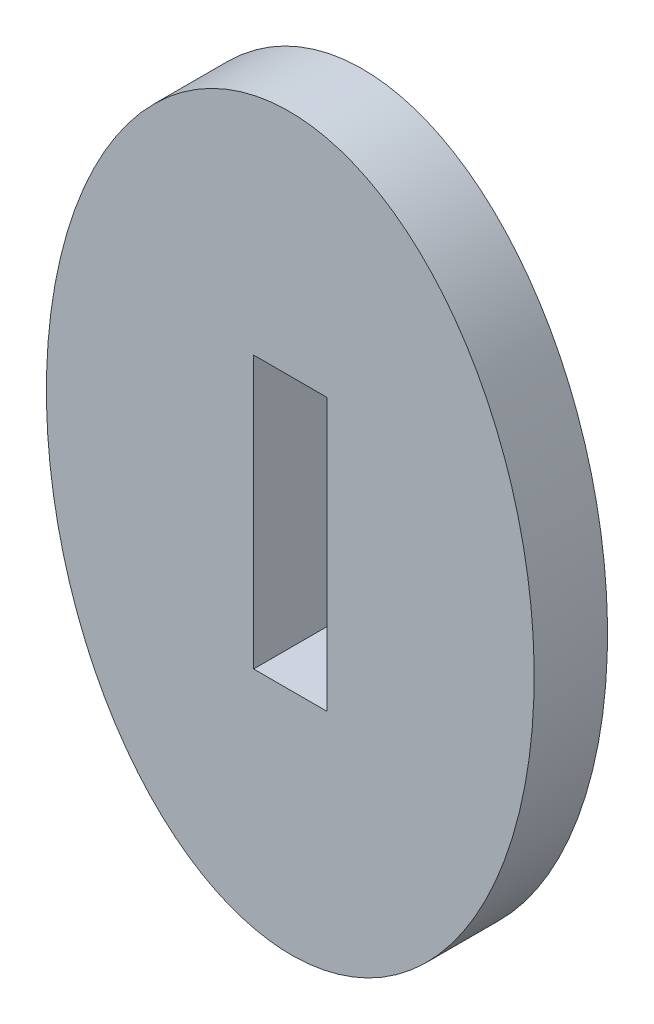
ISO-10303-21;
HEADER;
FILE_DESCRIPTION(('STEP AP214'),'2;1');
FILE_NAME('part.step','',(''),(''),'','','');
FILE_SCHEMA(('AUTOMOTIVE_DESIGN { 1 0 10303 214 1 1 1 1 }'));
ENDSEC;
DATA;
#1=APPLICATION_CONTEXT('core data for automotive mechanical design processes');
#2=APPLICATION_PROTOCOL_DEFINITION('international standard','automotive_design',2000,#1);
#3=PRODUCT_CONTEXT('',#1,'mechanical');
#4=PRODUCT('Part','Part','',(#3));
#5=PRODUCT_RELATED_PRODUCT_CATEGORY('part','',(#4));
#6=PRODUCT_DEFINITION_FORMATION('','',#4);
#7=PRODUCT_DEFINITION_CONTEXT('part definition',#1,'design');
#8=PRODUCT_DEFINITION('design','',#6,#7);
#9=PRODUCT_DEFINITION_SHAPE('','',#8);
#10=(LENGTH_UNIT() NAMED_UNIT(*) SI_UNIT(.MILLI.,.METRE.));
#11=(NAMED_UNIT(*) PLANE_ANGLE_UNIT() SI_UNIT($,.RADIAN.));
#12=(NAMED_UNIT(*) SI_UNIT($,.STERADIAN.) SOLID_ANGLE_UNIT());
#13=UNCERTAINTY_MEASURE_WITH_UNIT(LENGTH_MEASURE(1.E-05),#10,'distance_accuracy_value','');
#14=(GEOMETRIC_REPRESENTATION_CONTEXT(3) GLOBAL_UNCERTAINTY_ASSIGNED_CONTEXT((#13)) GLOBAL_UNIT_ASSIGNED_CONTEXT((#10,
#11,#12)) REPRESENTATION_CONTEXT('',''));
#15=CARTESIAN_POINT('',(0.,0.,0.));
#16=DIRECTION('',(0.,0.,1.));
#17=DIRECTION('',(1.,0.,0.));
#18=AXIS2_PLACEMENT_3D('',#15,#16,#17);
#19=CARTESIAN_POINT('',(0.,0.,2.99999999999997));
#20=DIRECTION('',(0.,0.,0.999999999999999));
#21=DIRECTION('',(1.,0.,0.));
#22=AXIS2_PLACEMENT_3D('',#19,#20,#21);
#23=PLANE('',#22);
#24=CARTESIAN_POINT('',(0.,0.,2.99999999999997));
#25=DIRECTION('',(0.,0.,0.999999999999999));
#26=DIRECTION('',(0.0065730866860782,-0.999978397032365,0.));
#27=AXIS2_PLACEMENT_3D('',#24,#25,#26);
#28=ELLIPSE('',#27,14.919059526714,9.9749400771447);
#29=CARTESIAN_POINT('',(0.0980642715438518,-14.9187372307539,2.99999999999997));
#30=VERTEX_POINT('',#29);
#31=EDGE_CURVE('E11',#30,#30,#28,.T.);
#32=ORIENTED_EDGE('',*,*,#31,.T.);
#33=EDGE_LOOP('',(#32));
#34=FACE_BOUND('',#33,.T.);
#35=DIRECTION('',(1.,0.,0.));
#36=VECTOR('',#35,1.);
#37=CARTESIAN_POINT('',(-1.5,-5.56,3.));
#38=LINE('',#37,#36);
#39=CARTESIAN_POINT('',(-1.5,-5.56,3.));
#40=VERTEX_POINT('',#39);
#41=CARTESIAN_POINT('',(1.49999999999999,-5.56,2.99999999999998));
#42=VERTEX_POINT('',#41);
#43=EDGE_CURVE('E99',#40,#42,#38,.T.);
#44=ORIENTED_EDGE('',*,*,#43,.F.);
#45=DIRECTION('',(0.,-1.,0.));
#46=VECTOR('',#45,1.);
#47=CARTESIAN_POINT('',(-1.50000000000001,5.56000000000002,2.99999999999998));
#48=LINE('',#47,#46);
#49=CARTESIAN_POINT('',(-1.50000000000001,5.56000000000002,2.99999999999998));
#50=VERTEX_POINT('',#49);
#51=EDGE_CURVE('E89',#50,#40,#48,.T.);
#52=ORIENTED_EDGE('',*,*,#51,.F.);
#53=DIRECTION('',(-1.,0.,0.));
#54=VECTOR('',#53,1.);
#55=CARTESIAN_POINT('',(-1.50000000000001,5.56000000000002,2.99999999999998));
#56=LINE('',#55,#54);
#57=CARTESIAN_POINT('',(1.5,5.55999999999998,2.99999999999998));
#58=VERTEX_POINT('',#57);
#59=EDGE_CURVE('E103',#58,#50,#56,.T.);
#60=ORIENTED_EDGE('',*,*,#59,.F.);
#61=DIRECTION('',(0.,0.999999999999999,0.));
#62=VECTOR('',#61,1.);
#63=CARTESIAN_POINT('',(1.5,5.55999999999998,2.99999999999998));
#64=LINE('',#63,#62);
#65=EDGE_CURVE('E101',#42,#58,#64,.T.);
#66=ORIENTED_EDGE('',*,*,#65,.F.);
#67=EDGE_LOOP('',(#44,#52,#60,#66));
#68=FACE_BOUND('',#67,.T.);
#69=ADVANCED_FACE('F32',(#34,#68),#23,.T.);
#70=CARTESIAN_POINT('',(0.,0.,0.));
#71=DIRECTION('',(0.,0.,0.999999999999999));
#72=DIRECTION('',(1.,0.,0.));
#73=AXIS2_PLACEMENT_3D('',#70,#71,#72);
#74=PLANE('',#73);
#75=CARTESIAN_POINT('',(0.,0.,0.));
#76=DIRECTION('',(0.,0.,0.999999999999999));
#77=DIRECTION('',(0.0065730866860782,-0.999978397032365,0.));
#78=AXIS2_PLACEMENT_3D('',#75,#76,#77);
#79=ELLIPSE('',#78,14.919059526714,9.9749400771447);
#80=CARTESIAN_POINT('',(0.0980642715438501,-14.9187372307539,0.));
#81=VERTEX_POINT('',#80);
#82=EDGE_CURVE('E41',#81,#81,#79,.T.);
#83=ORIENTED_EDGE('',*,*,#82,.F.);
#84=EDGE_LOOP('',(#83));
#85=FACE_BOUND('',#84,.T.);
#86=DIRECTION('',(0.,-1.,0.));
#87=VECTOR('',#86,1.);
#88=CARTESIAN_POINT('',(-1.5,5.56,0.));
#89=LINE('',#88,#87);
#90=CARTESIAN_POINT('',(-1.5,5.56,0.));
#91=VERTEX_POINT('',#90);
#92=CARTESIAN_POINT('',(-1.50000000000001,-5.56,0.));
#93=VERTEX_POINT('',#92);
#94=EDGE_CURVE('E56',#91,#93,#89,.T.);
#95=ORIENTED_EDGE('',*,*,#94,.T.);
#96=DIRECTION('',(1.,0.,0.));
#97=VECTOR('',#96,1.);
#98=CARTESIAN_POINT('',(-1.50000000000001,-5.56,0.));
#99=LINE('',#98,#97);
#100=CARTESIAN_POINT('',(1.5,-5.56,0.));
#101=VERTEX_POINT('',#100);
#102=EDGE_CURVE('E76',#93,#101,#99,.T.);
#103=ORIENTED_EDGE('',*,*,#102,.T.);
#104=DIRECTION('',(0.,0.999999999999999,0.));
#105=VECTOR('',#104,1.);
#106=CARTESIAN_POINT('',(1.49999999999999,5.56000000000004,0.));
#107=LINE('',#106,#105);
#108=CARTESIAN_POINT('',(1.49999999999999,5.56000000000004,0.));
#109=VERTEX_POINT('',#108);
#110=EDGE_CURVE('E85',#101,#109,#107,.T.);
#111=ORIENTED_EDGE('',*,*,#110,.T.);
#112=DIRECTION('',(-1.,0.,0.));
#113=VECTOR('',#112,1.);
#114=CARTESIAN_POINT('',(-1.5,5.56,0.));
#115=LINE('',#114,#113);
#116=EDGE_CURVE('E93',#109,#91,#115,.T.);
#117=ORIENTED_EDGE('',*,*,#116,.T.);
#118=EDGE_LOOP('',(#95,#103,#111,#117));
#119=FACE_BOUND('',#118,.T.);
#120=ADVANCED_FACE('F92',(#85,#119),#74,.F.);
#121=DIRECTION('',(0.,0.,-0.999999999999999));
#122=VECTOR('',#121,1.);
#123=SURFACE_OF_LINEAR_EXTRUSION('',#28,#122);
#124=ORIENTED_EDGE('',*,*,#31,.F.);
#125=EDGE_LOOP('',(#124));
#126=FACE_BOUND('',#125,.T.);
#127=ORIENTED_EDGE('',*,*,#82,.T.);
#128=EDGE_LOOP('',(#127));
#129=FACE_BOUND('',#128,.T.);
#130=ADVANCED_FACE('F34',(#126,#129),#123,.F.);
#131=CARTESIAN_POINT('',(-1.50000000000001,5.56000000000002,2.99999999999998));
#132=DIRECTION('',(1.,0.,0.));
#133=DIRECTION('',(0.,1.,0.));
#134=AXIS2_PLACEMENT_3D('',#131,#132,#133);
#135=PLANE('',#134);
#136=ORIENTED_EDGE('',*,*,#94,.F.);
#137=DIRECTION('',(0.,0.,-0.999999999999999));
#138=VECTOR('',#137,1.);
#139=CARTESIAN_POINT('',(-1.50000000000001,5.56000000000002,2.99999999999998));
#140=LINE('',#139,#138);
#141=EDGE_CURVE('E105',#50,#91,#140,.T.);
#142=ORIENTED_EDGE('',*,*,#141,.F.);
#143=ORIENTED_EDGE('',*,*,#51,.T.);
#144=DIRECTION('',(0.,0.,-0.999999999999999));
#145=VECTOR('',#144,1.);
#146=CARTESIAN_POINT('',(-1.5,-5.56,3.));
#147=LINE('',#146,#145);
#148=EDGE_CURVE('E78',#40,#93,#147,.T.);
#149=ORIENTED_EDGE('',*,*,#148,.T.);
#150=EDGE_LOOP('',(#136,#142,#143,#149));
#151=FACE_BOUND('',#150,.T.);
#152=ADVANCED_FACE('F87',(#151),#135,.T.);
#153=CARTESIAN_POINT('',(-1.5,-5.56,3.));
#154=DIRECTION('',(0.,1.,0.));
#155=DIRECTION('',(-1.,0.,0.));
#156=AXIS2_PLACEMENT_3D('',#153,#154,#155);
#157=PLANE('',#156);
#158=ORIENTED_EDGE('',*,*,#102,.F.);
#159=ORIENTED_EDGE('',*,*,#148,.F.);
#160=ORIENTED_EDGE('',*,*,#43,.T.);
#161=DIRECTION('',(0.,0.,-0.999999999999999));
#162=VECTOR('',#161,1.);
#163=CARTESIAN_POINT('',(1.49999999999999,-5.56,2.99999999999998));
#164=LINE('',#163,#162);
#165=EDGE_CURVE('E81',#42,#101,#164,.T.);
#166=ORIENTED_EDGE('',*,*,#165,.T.);
#167=EDGE_LOOP('',(#158,#159,#160,#166));
#168=FACE_BOUND('',#167,.T.);
#169=ADVANCED_FACE('F77',(#168),#157,.T.);
#170=CARTESIAN_POINT('',(1.5,5.55999999999998,2.99999999999998));
#171=DIRECTION('',(-1.,0.,0.));
#172=DIRECTION('',(0.,-0.999999999999999,0.));
#173=AXIS2_PLACEMENT_3D('',#170,#171,#172);
#174=PLANE('',#173);
#175=ORIENTED_EDGE('',*,*,#110,.F.);
#176=ORIENTED_EDGE('',*,*,#165,.F.);
#177=ORIENTED_EDGE('',*,*,#65,.T.);
#178=DIRECTION('',(0.,0.,-0.999999999999999));
#179=VECTOR('',#178,1.);
#180=CARTESIAN_POINT('',(1.5,5.55999999999998,2.99999999999998));
#181=LINE('',#180,#179);
#182=EDGE_CURVE('E48',#58,#109,#181,.T.);
#183=ORIENTED_EDGE('',*,*,#182,.T.);
#184=EDGE_LOOP('',(#175,#176,#177,#183));
#185=FACE_BOUND('',#184,.T.);
#186=ADVANCED_FACE('F125',(#185),#174,.T.);
#187=CARTESIAN_POINT('',(-1.50000000000001,5.56000000000002,2.99999999999998));
#188=DIRECTION('',(0.,-1.,0.));
#189=DIRECTION('',(0.,0.,-0.999999999999999));
#190=AXIS2_PLACEMENT_3D('',#187,#188,#189);
#191=PLANE('',#190);
#192=ORIENTED_EDGE('',*,*,#116,.F.);
#193=ORIENTED_EDGE('',*,*,#182,.F.);
#194=ORIENTED_EDGE('',*,*,#59,.T.);
#195=ORIENTED_EDGE('',*,*,#141,.T.);
#196=EDGE_LOOP('',(#192,#193,#194,#195));
#197=FACE_BOUND('',#196,.T.);
#198=ADVANCED_FACE('F128',(#197),#191,.T.);
#199=CLOSED_SHELL('',(#69,#120,#130,#152,#169,#186,#198));
#200=MANIFOLD_SOLID_BREP('B2',#199);
#201=ADVANCED_BREP_SHAPE_REPRESENTATION('',(#18,#200),#14);
#202=SHAPE_DEFINITION_REPRESENTATION(#9,#201);
ENDSEC;
END-ISO-10303-21;
